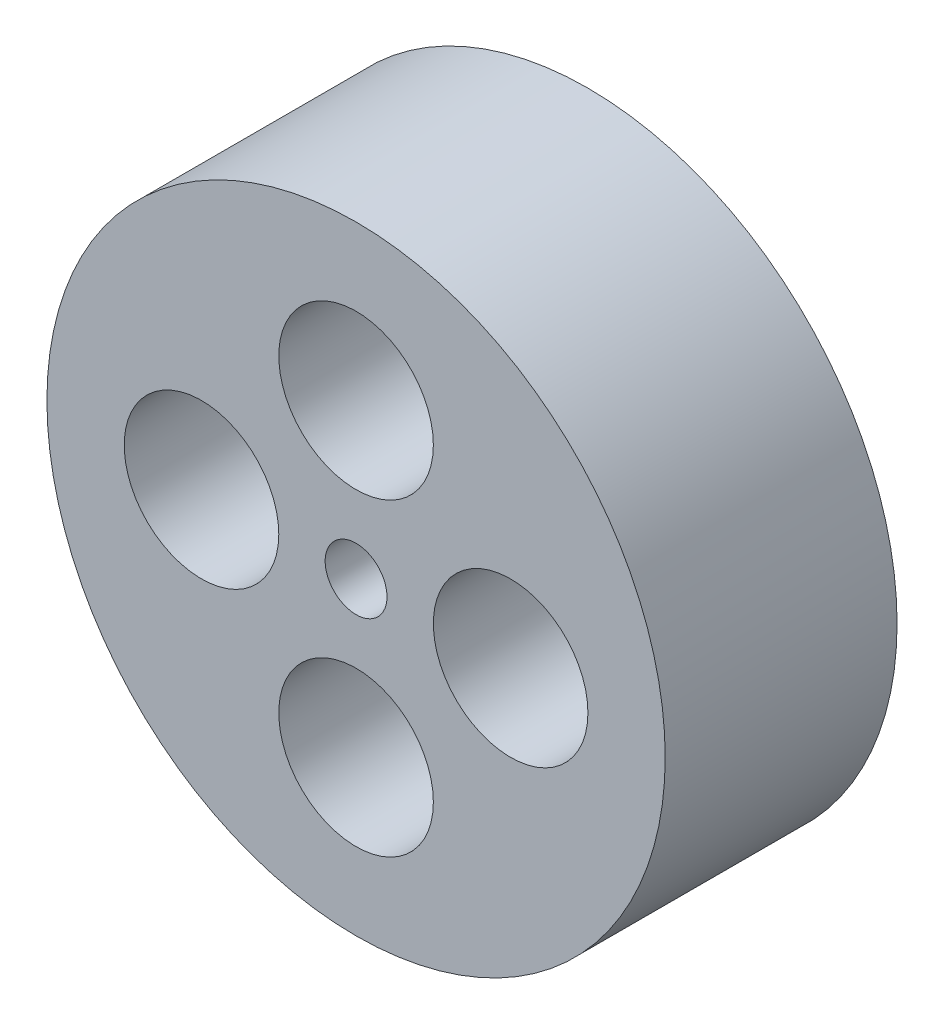
ISO-10303-21;
HEADER;
FILE_DESCRIPTION(('STEP AP214'),'2;1');
FILE_NAME('part.step','',(''),(''),'','','');
FILE_SCHEMA(('AUTOMOTIVE_DESIGN { 1 0 10303 214 1 1 1 1 }'));
ENDSEC;
DATA;
#1=APPLICATION_CONTEXT('core data for automotive mechanical design processes');
#2=APPLICATION_PROTOCOL_DEFINITION('international standard','automotive_design',2000,#1);
#3=PRODUCT_CONTEXT('',#1,'mechanical');
#4=PRODUCT('Part','Part','',(#3));
#5=PRODUCT_RELATED_PRODUCT_CATEGORY('part','',(#4));
#6=PRODUCT_DEFINITION_FORMATION('','',#4);
#7=PRODUCT_DEFINITION_CONTEXT('part definition',#1,'design');
#8=PRODUCT_DEFINITION('design','',#6,#7);
#9=PRODUCT_DEFINITION_SHAPE('','',#8);
#10=(LENGTH_UNIT() NAMED_UNIT(*) SI_UNIT(.MILLI.,.METRE.));
#11=(NAMED_UNIT(*) PLANE_ANGLE_UNIT() SI_UNIT($,.RADIAN.));
#12=(NAMED_UNIT(*) SI_UNIT($,.STERADIAN.) SOLID_ANGLE_UNIT());
#13=UNCERTAINTY_MEASURE_WITH_UNIT(LENGTH_MEASURE(1.E-05),#10,'distance_accuracy_value','');
#14=(GEOMETRIC_REPRESENTATION_CONTEXT(3) GLOBAL_UNCERTAINTY_ASSIGNED_CONTEXT((#13)) GLOBAL_UNIT_ASSIGNED_CONTEXT((#10,
#11,#12)) REPRESENTATION_CONTEXT('',''));
#15=CARTESIAN_POINT('',(0.,0.,0.));
#16=DIRECTION('',(0.,0.,1.));
#17=DIRECTION('',(1.,0.,0.));
#18=AXIS2_PLACEMENT_3D('',#15,#16,#17);
#19=CARTESIAN_POINT('',(0.,0.,30.));
#20=DIRECTION('',(0.,0.,1.));
#21=DIRECTION('',(1.,0.,0.));
#22=AXIS2_PLACEMENT_3D('',#19,#20,#21);
#23=PLANE('',#22);
#24=CARTESIAN_POINT('',(-1.39659253553725E-13,-20.,30.));
#25=DIRECTION('',(0.,0.,1.));
#26=DIRECTION('',(1.,0.,0.));
#27=AXIS2_PLACEMENT_3D('',#24,#25,#26);
#28=CIRCLE('',#27,10.);
#29=CARTESIAN_POINT('',(9.99999999999986,-20.,30.));
#30=VERTEX_POINT('',#29);
#31=EDGE_CURVE('E76',#30,#30,#28,.T.);
#32=ORIENTED_EDGE('',*,*,#31,.F.);
#33=EDGE_LOOP('',(#32));
#34=FACE_BOUND('',#33,.T.);
#35=CARTESIAN_POINT('',(0.,20.,30.));
#36=DIRECTION('',(0.,0.,1.));
#37=DIRECTION('',(1.,0.,0.));
#38=AXIS2_PLACEMENT_3D('',#35,#36,#37);
#39=CIRCLE('',#38,10.);
#40=CARTESIAN_POINT('',(10.,20.,30.));
#41=VERTEX_POINT('',#40);
#42=EDGE_CURVE('E60',#41,#41,#39,.T.);
#43=ORIENTED_EDGE('',*,*,#42,.F.);
#44=EDGE_LOOP('',(#43));
#45=FACE_BOUND('',#44,.T.);
#46=CARTESIAN_POINT('',(0.,0.,30.));
#47=DIRECTION('',(0.,0.,1.));
#48=DIRECTION('',(1.,0.,0.));
#49=AXIS2_PLACEMENT_3D('',#46,#47,#48);
#50=CIRCLE('',#49,40.);
#51=CARTESIAN_POINT('',(40.,0.,30.));
#52=VERTEX_POINT('',#51);
#53=EDGE_CURVE('E10',#52,#52,#50,.T.);
#54=ORIENTED_EDGE('',*,*,#53,.T.);
#55=EDGE_LOOP('',(#54));
#56=FACE_BOUND('',#55,.T.);
#57=CARTESIAN_POINT('',(0.,0.,30.));
#58=DIRECTION('',(0.,0.,1.));
#59=DIRECTION('',(1.,0.,0.));
#60=AXIS2_PLACEMENT_3D('',#57,#58,#59);
#61=CIRCLE('',#60,4.);
#62=CARTESIAN_POINT('',(4.,0.,30.));
#63=VERTEX_POINT('',#62);
#64=EDGE_CURVE('E54',#63,#63,#61,.T.);
#65=ORIENTED_EDGE('',*,*,#64,.F.);
#66=EDGE_LOOP('',(#65));
#67=FACE_BOUND('',#66,.T.);
#68=CARTESIAN_POINT('',(20.,0.,30.));
#69=DIRECTION('',(0.,0.,1.));
#70=DIRECTION('',(1.,0.,0.));
#71=AXIS2_PLACEMENT_3D('',#68,#69,#70);
#72=CIRCLE('',#71,10.);
#73=CARTESIAN_POINT('',(30.,0.,30.));
#74=VERTEX_POINT('',#73);
#75=EDGE_CURVE('E68',#74,#74,#72,.T.);
#76=ORIENTED_EDGE('',*,*,#75,.F.);
#77=EDGE_LOOP('',(#76));
#78=FACE_BOUND('',#77,.T.);
#79=CARTESIAN_POINT('',(-20.,2.09488880330588E-13,30.));
#80=DIRECTION('',(0.,0.,1.));
#81=DIRECTION('',(1.,0.,0.));
#82=AXIS2_PLACEMENT_3D('',#79,#80,#81);
#83=CIRCLE('',#82,10.);
#84=CARTESIAN_POINT('',(-10.,2.09488880330588E-13,30.));
#85=VERTEX_POINT('',#84);
#86=EDGE_CURVE('E84',#85,#85,#83,.T.);
#87=ORIENTED_EDGE('',*,*,#86,.F.);
#88=EDGE_LOOP('',(#87));
#89=FACE_BOUND('',#88,.T.);
#90=ADVANCED_FACE('F41',(#34,#45,#56,#67,#78,#89),#23,.T.);
#91=CARTESIAN_POINT('',(0.,0.,0.));
#92=DIRECTION('',(0.,0.,1.));
#93=DIRECTION('',(1.,0.,0.));
#94=AXIS2_PLACEMENT_3D('',#91,#92,#93);
#95=PLANE('',#94);
#96=CARTESIAN_POINT('',(0.,0.,0.));
#97=DIRECTION('',(0.,0.,1.));
#98=DIRECTION('',(1.,0.,0.));
#99=AXIS2_PLACEMENT_3D('',#96,#97,#98);
#100=CIRCLE('',#99,40.);
#101=CARTESIAN_POINT('',(40.,0.,0.));
#102=VERTEX_POINT('',#101);
#103=EDGE_CURVE('E45',#102,#102,#100,.T.);
#104=ORIENTED_EDGE('',*,*,#103,.F.);
#105=EDGE_LOOP('',(#104));
#106=FACE_BOUND('',#105,.T.);
#107=CARTESIAN_POINT('',(0.,0.,0.));
#108=DIRECTION('',(0.,0.,1.));
#109=DIRECTION('',(1.,0.,0.));
#110=AXIS2_PLACEMENT_3D('',#107,#108,#109);
#111=CIRCLE('',#110,4.);
#112=CARTESIAN_POINT('',(4.,0.,0.));
#113=VERTEX_POINT('',#112);
#114=EDGE_CURVE('E56',#113,#113,#111,.T.);
#115=ORIENTED_EDGE('',*,*,#114,.T.);
#116=EDGE_LOOP('',(#115));
#117=FACE_BOUND('',#116,.T.);
#118=CARTESIAN_POINT('',(0.,20.,0.));
#119=DIRECTION('',(0.,0.,1.));
#120=DIRECTION('',(1.,0.,0.));
#121=AXIS2_PLACEMENT_3D('',#118,#119,#120);
#122=CIRCLE('',#121,10.);
#123=CARTESIAN_POINT('',(10.,20.,0.));
#124=VERTEX_POINT('',#123);
#125=EDGE_CURVE('E64',#124,#124,#122,.T.);
#126=ORIENTED_EDGE('',*,*,#125,.T.);
#127=EDGE_LOOP('',(#126));
#128=FACE_BOUND('',#127,.T.);
#129=CARTESIAN_POINT('',(20.,0.,0.));
#130=DIRECTION('',(0.,0.,1.));
#131=DIRECTION('',(1.,0.,0.));
#132=AXIS2_PLACEMENT_3D('',#129,#130,#131);
#133=CIRCLE('',#132,10.);
#134=CARTESIAN_POINT('',(30.,0.,0.));
#135=VERTEX_POINT('',#134);
#136=EDGE_CURVE('E72',#135,#135,#133,.T.);
#137=ORIENTED_EDGE('',*,*,#136,.T.);
#138=EDGE_LOOP('',(#137));
#139=FACE_BOUND('',#138,.T.);
#140=CARTESIAN_POINT('',(-1.39659253553725E-13,-20.,0.));
#141=DIRECTION('',(0.,0.,1.));
#142=DIRECTION('',(1.,0.,0.));
#143=AXIS2_PLACEMENT_3D('',#140,#141,#142);
#144=CIRCLE('',#143,10.);
#145=CARTESIAN_POINT('',(9.99999999999986,-20.,0.));
#146=VERTEX_POINT('',#145);
#147=EDGE_CURVE('E80',#146,#146,#144,.T.);
#148=ORIENTED_EDGE('',*,*,#147,.T.);
#149=EDGE_LOOP('',(#148));
#150=FACE_BOUND('',#149,.T.);
#151=CARTESIAN_POINT('',(-20.,2.09488880330588E-13,0.));
#152=DIRECTION('',(0.,0.,1.));
#153=DIRECTION('',(1.,0.,0.));
#154=AXIS2_PLACEMENT_3D('',#151,#152,#153);
#155=CIRCLE('',#154,10.);
#156=CARTESIAN_POINT('',(-10.,2.09488880330588E-13,0.));
#157=VERTEX_POINT('',#156);
#158=EDGE_CURVE('E88',#157,#157,#155,.T.);
#159=ORIENTED_EDGE('',*,*,#158,.T.);
#160=EDGE_LOOP('',(#159));
#161=FACE_BOUND('',#160,.T.);
#162=ADVANCED_FACE('F100',(#106,#117,#128,#139,#150,#161),#95,.F.);
#163=CARTESIAN_POINT('',(0.,0.,30.));
#164=DIRECTION('',(0.,0.,-1.));
#165=DIRECTION('',(-1.,0.,0.));
#166=AXIS2_PLACEMENT_3D('',#163,#164,#165);
#167=CYLINDRICAL_SURFACE('',#166,40.);
#168=ORIENTED_EDGE('',*,*,#53,.F.);
#169=EDGE_LOOP('',(#168));
#170=FACE_BOUND('',#169,.T.);
#171=ORIENTED_EDGE('',*,*,#103,.T.);
#172=EDGE_LOOP('',(#171));
#173=FACE_BOUND('',#172,.T.);
#174=ADVANCED_FACE('F43',(#170,#173),#167,.T.);
#175=CARTESIAN_POINT('',(0.,0.,30.));
#176=DIRECTION('',(0.,0.,-1.));
#177=DIRECTION('',(-1.,0.,0.));
#178=AXIS2_PLACEMENT_3D('',#175,#176,#177);
#179=CYLINDRICAL_SURFACE('',#178,4.);
#180=ORIENTED_EDGE('',*,*,#64,.T.);
#181=EDGE_LOOP('',(#180));
#182=FACE_BOUND('',#181,.T.);
#183=ORIENTED_EDGE('',*,*,#114,.F.);
#184=EDGE_LOOP('',(#183));
#185=FACE_BOUND('',#184,.T.);
#186=ADVANCED_FACE('F110',(#182,#185),#179,.F.);
#187=CARTESIAN_POINT('',(0.,20.,30.));
#188=DIRECTION('',(0.,0.,-1.));
#189=DIRECTION('',(-1.,0.,0.));
#190=AXIS2_PLACEMENT_3D('',#187,#188,#189);
#191=CYLINDRICAL_SURFACE('',#190,10.);
#192=ORIENTED_EDGE('',*,*,#42,.T.);
#193=EDGE_LOOP('',(#192));
#194=FACE_BOUND('',#193,.T.);
#195=ORIENTED_EDGE('',*,*,#125,.F.);
#196=EDGE_LOOP('',(#195));
#197=FACE_BOUND('',#196,.T.);
#198=ADVANCED_FACE('F113',(#194,#197),#191,.F.);
#199=CARTESIAN_POINT('',(20.,0.,30.));
#200=DIRECTION('',(0.,0.,-1.));
#201=DIRECTION('',(-1.,0.,0.));
#202=AXIS2_PLACEMENT_3D('',#199,#200,#201);
#203=CYLINDRICAL_SURFACE('',#202,10.);
#204=ORIENTED_EDGE('',*,*,#75,.T.);
#205=EDGE_LOOP('',(#204));
#206=FACE_BOUND('',#205,.T.);
#207=ORIENTED_EDGE('',*,*,#136,.F.);
#208=EDGE_LOOP('',(#207));
#209=FACE_BOUND('',#208,.T.);
#210=ADVANCED_FACE('F117',(#206,#209),#203,.F.);
#211=CARTESIAN_POINT('',(-1.39659253553725E-13,-20.,30.));
#212=DIRECTION('',(0.,0.,-1.));
#213=DIRECTION('',(-1.,0.,0.));
#214=AXIS2_PLACEMENT_3D('',#211,#212,#213);
#215=CYLINDRICAL_SURFACE('',#214,10.);
#216=ORIENTED_EDGE('',*,*,#31,.T.);
#217=EDGE_LOOP('',(#216));
#218=FACE_BOUND('',#217,.T.);
#219=ORIENTED_EDGE('',*,*,#147,.F.);
#220=EDGE_LOOP('',(#219));
#221=FACE_BOUND('',#220,.T.);
#222=ADVANCED_FACE('F121',(#218,#221),#215,.F.);
#223=CARTESIAN_POINT('',(-20.,2.09488880330588E-13,30.));
#224=DIRECTION('',(0.,0.,-1.));
#225=DIRECTION('',(-1.,0.,0.));
#226=AXIS2_PLACEMENT_3D('',#223,#224,#225);
#227=CYLINDRICAL_SURFACE('',#226,10.);
#228=ORIENTED_EDGE('',*,*,#86,.T.);
#229=EDGE_LOOP('',(#228));
#230=FACE_BOUND('',#229,.T.);
#231=ORIENTED_EDGE('',*,*,#158,.F.);
#232=EDGE_LOOP('',(#231));
#233=FACE_BOUND('',#232,.T.);
#234=ADVANCED_FACE('F96',(#230,#233),#227,.F.);
#235=CLOSED_SHELL('',(#90,#162,#174,#186,#198,#210,#222,#234));
#236=MANIFOLD_SOLID_BREP('B2',#235);
#237=ADVANCED_BREP_SHAPE_REPRESENTATION('',(#18,#236),#14);
#238=SHAPE_DEFINITION_REPRESENTATION(#9,#237);
ENDSEC;
END-ISO-10303-21;
